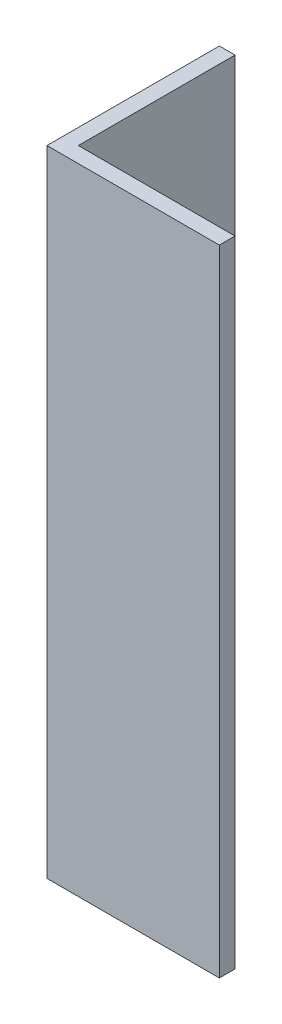
ISO-10303-21;
HEADER;
FILE_DESCRIPTION(('STEP AP214'),'2;1');
FILE_NAME('part.step','',(''),(''),'','','');
FILE_SCHEMA(('AUTOMOTIVE_DESIGN { 1 0 10303 214 1 1 1 1 }'));
ENDSEC;
DATA;
#1=APPLICATION_CONTEXT('core data for automotive mechanical design processes');
#2=APPLICATION_PROTOCOL_DEFINITION('international standard','automotive_design',2000,#1);
#3=PRODUCT_CONTEXT('',#1,'mechanical');
#4=PRODUCT('Part','Part','',(#3));
#5=PRODUCT_RELATED_PRODUCT_CATEGORY('part','',(#4));
#6=PRODUCT_DEFINITION_FORMATION('','',#4);
#7=PRODUCT_DEFINITION_CONTEXT('part definition',#1,'design');
#8=PRODUCT_DEFINITION('design','',#6,#7);
#9=PRODUCT_DEFINITION_SHAPE('','',#8);
#10=(LENGTH_UNIT() NAMED_UNIT(*) SI_UNIT(.MILLI.,.METRE.));
#11=(NAMED_UNIT(*) PLANE_ANGLE_UNIT() SI_UNIT($,.RADIAN.));
#12=(NAMED_UNIT(*) SI_UNIT($,.STERADIAN.) SOLID_ANGLE_UNIT());
#13=UNCERTAINTY_MEASURE_WITH_UNIT(LENGTH_MEASURE(1.E-05),#10,'distance_accuracy_value','');
#14=(GEOMETRIC_REPRESENTATION_CONTEXT(3) GLOBAL_UNCERTAINTY_ASSIGNED_CONTEXT((#13)) GLOBAL_UNIT_ASSIGNED_CONTEXT((#10,
#11,#12)) REPRESENTATION_CONTEXT('',''));
#15=CARTESIAN_POINT('',(0.,0.,0.));
#16=DIRECTION('',(0.,0.,1.));
#17=DIRECTION('',(1.,0.,0.));
#18=AXIS2_PLACEMENT_3D('',#15,#16,#17);
#19=CARTESIAN_POINT('',(-2.,81.,1.07187339486148));
#20=DIRECTION('',(0.,0.,1.));
#21=DIRECTION('',(1.,0.,0.));
#22=AXIS2_PLACEMENT_3D('',#19,#20,#21);
#23=PLANE('',#22);
#24=DIRECTION('',(-1.,0.,0.));
#25=VECTOR('',#24,1.);
#26=CARTESIAN_POINT('',(-2.,0.,1.07187339486148));
#27=LINE('',#26,#25);
#28=CARTESIAN_POINT('',(0.,0.,1.07187339486148));
#29=VERTEX_POINT('',#28);
#30=CARTESIAN_POINT('',(-2.,0.,1.07187339486148));
#31=VERTEX_POINT('',#30);
#32=EDGE_CURVE('E116',#29,#31,#27,.T.);
#33=ORIENTED_EDGE('',*,*,#32,.T.);
#34=DIRECTION('',(0.,-1.,0.));
#35=VECTOR('',#34,1.);
#36=CARTESIAN_POINT('',(-2.,81.,1.07187339486148));
#37=LINE('',#36,#35);
#38=CARTESIAN_POINT('',(-2.,81.,1.07187339486148));
#39=VERTEX_POINT('',#38);
#40=EDGE_CURVE('E11',#39,#31,#37,.T.);
#41=ORIENTED_EDGE('',*,*,#40,.F.);
#42=DIRECTION('',(-1.,0.,0.));
#43=VECTOR('',#42,1.);
#44=CARTESIAN_POINT('',(-2.,81.,1.07187339486148));
#45=LINE('',#44,#43);
#46=CARTESIAN_POINT('',(0.,81.,1.07187339486148));
#47=VERTEX_POINT('',#46);
#48=EDGE_CURVE('E126',#47,#39,#45,.T.);
#49=ORIENTED_EDGE('',*,*,#48,.F.);
#50=DIRECTION('',(0.,-1.,0.));
#51=VECTOR('',#50,1.);
#52=CARTESIAN_POINT('',(0.,81.,1.07187339486148));
#53=LINE('',#52,#51);
#54=EDGE_CURVE('E112',#47,#29,#53,.T.);
#55=ORIENTED_EDGE('',*,*,#54,.T.);
#56=EDGE_LOOP('',(#33,#41,#49,#55));
#57=FACE_BOUND('',#56,.T.);
#58=ADVANCED_FACE('F32',(#57),#23,.F.);
#59=CARTESIAN_POINT('',(-2.,81.,23.0718733948615));
#60=DIRECTION('',(1.,0.,0.));
#61=DIRECTION('',(0.,0.,-1.));
#62=AXIS2_PLACEMENT_3D('',#59,#60,#61);
#63=PLANE('',#62);
#64=DIRECTION('',(0.,0.,1.));
#65=VECTOR('',#64,1.);
#66=CARTESIAN_POINT('',(-2.,0.,23.0718733948615));
#67=LINE('',#66,#65);
#68=CARTESIAN_POINT('',(-2.,0.,23.0718733948615));
#69=VERTEX_POINT('',#68);
#70=EDGE_CURVE('E119',#31,#69,#67,.T.);
#71=ORIENTED_EDGE('',*,*,#70,.T.);
#72=DIRECTION('',(0.,-1.,0.));
#73=VECTOR('',#72,1.);
#74=CARTESIAN_POINT('',(-2.,81.,23.0718733948615));
#75=LINE('',#74,#73);
#76=CARTESIAN_POINT('',(-2.,81.,23.0718733948615));
#77=VERTEX_POINT('',#76);
#78=EDGE_CURVE('E40',#77,#69,#75,.T.);
#79=ORIENTED_EDGE('',*,*,#78,.F.);
#80=DIRECTION('',(0.,0.,1.));
#81=VECTOR('',#80,1.);
#82=CARTESIAN_POINT('',(-2.,81.,23.0718733948615));
#83=LINE('',#82,#81);
#84=EDGE_CURVE('E85',#39,#77,#83,.T.);
#85=ORIENTED_EDGE('',*,*,#84,.F.);
#86=ORIENTED_EDGE('',*,*,#40,.T.);
#87=EDGE_LOOP('',(#71,#79,#85,#86));
#88=FACE_BOUND('',#87,.T.);
#89=ADVANCED_FACE('F150',(#88),#63,.F.);
#90=CARTESIAN_POINT('',(20.,81.,23.0718733948615));
#91=DIRECTION('',(0.,0.,-1.));
#92=DIRECTION('',(-1.,0.,0.));
#93=AXIS2_PLACEMENT_3D('',#90,#91,#92);
#94=PLANE('',#93);
#95=DIRECTION('',(1.,0.,0.));
#96=VECTOR('',#95,1.);
#97=CARTESIAN_POINT('',(20.,0.,23.0718733948615));
#98=LINE('',#97,#96);
#99=CARTESIAN_POINT('',(20.,0.,23.0718733948615));
#100=VERTEX_POINT('',#99);
#101=EDGE_CURVE('E121',#69,#100,#98,.T.);
#102=ORIENTED_EDGE('',*,*,#101,.T.);
#103=DIRECTION('',(0.,-1.,0.));
#104=VECTOR('',#103,1.);
#105=CARTESIAN_POINT('',(20.,81.,23.0718733948615));
#106=LINE('',#105,#104);
#107=CARTESIAN_POINT('',(20.,81.,23.0718733948615));
#108=VERTEX_POINT('',#107);
#109=EDGE_CURVE('E107',#108,#100,#106,.T.);
#110=ORIENTED_EDGE('',*,*,#109,.F.);
#111=DIRECTION('',(1.,0.,0.));
#112=VECTOR('',#111,1.);
#113=CARTESIAN_POINT('',(20.,81.,23.0718733948615));
#114=LINE('',#113,#112);
#115=EDGE_CURVE('E98',#77,#108,#114,.T.);
#116=ORIENTED_EDGE('',*,*,#115,.F.);
#117=ORIENTED_EDGE('',*,*,#78,.T.);
#118=EDGE_LOOP('',(#102,#110,#116,#117));
#119=FACE_BOUND('',#118,.T.);
#120=ADVANCED_FACE('F132',(#119),#94,.F.);
#121=CARTESIAN_POINT('',(20.,81.,21.0718733948615));
#122=DIRECTION('',(-1.,0.,0.));
#123=DIRECTION('',(0.,0.,1.));
#124=AXIS2_PLACEMENT_3D('',#121,#122,#123);
#125=PLANE('',#124);
#126=DIRECTION('',(0.,0.,-1.));
#127=VECTOR('',#126,1.);
#128=CARTESIAN_POINT('',(20.,0.,21.0718733948615));
#129=LINE('',#128,#127);
#130=CARTESIAN_POINT('',(20.,0.,21.0718733948615));
#131=VERTEX_POINT('',#130);
#132=EDGE_CURVE('E106',#100,#131,#129,.T.);
#133=ORIENTED_EDGE('',*,*,#132,.T.);
#134=DIRECTION('',(0.,-1.,0.));
#135=VECTOR('',#134,1.);
#136=CARTESIAN_POINT('',(20.,81.,21.0718733948615));
#137=LINE('',#136,#135);
#138=CARTESIAN_POINT('',(20.,81.,21.0718733948615));
#139=VERTEX_POINT('',#138);
#140=EDGE_CURVE('E103',#139,#131,#137,.T.);
#141=ORIENTED_EDGE('',*,*,#140,.F.);
#142=DIRECTION('',(0.,0.,-1.));
#143=VECTOR('',#142,1.);
#144=CARTESIAN_POINT('',(20.,81.,21.0718733948615));
#145=LINE('',#144,#143);
#146=EDGE_CURVE('E92',#108,#139,#145,.T.);
#147=ORIENTED_EDGE('',*,*,#146,.F.);
#148=ORIENTED_EDGE('',*,*,#109,.T.);
#149=EDGE_LOOP('',(#133,#141,#147,#148));
#150=FACE_BOUND('',#149,.T.);
#151=ADVANCED_FACE('F104',(#150),#125,.F.);
#152=CARTESIAN_POINT('',(0.,81.,21.0718733948615));
#153=DIRECTION('',(0.,0.,1.));
#154=DIRECTION('',(1.,0.,0.));
#155=AXIS2_PLACEMENT_3D('',#152,#153,#154);
#156=PLANE('',#155);
#157=DIRECTION('',(-1.,0.,0.));
#158=VECTOR('',#157,1.);
#159=CARTESIAN_POINT('',(0.,0.,21.0718733948615));
#160=LINE('',#159,#158);
#161=CARTESIAN_POINT('',(0.,0.,21.0718733948615));
#162=VERTEX_POINT('',#161);
#163=EDGE_CURVE('E71',#131,#162,#160,.T.);
#164=ORIENTED_EDGE('',*,*,#163,.T.);
#165=DIRECTION('',(0.,-1.,0.));
#166=VECTOR('',#165,1.);
#167=CARTESIAN_POINT('',(0.,81.,21.0718733948615));
#168=LINE('',#167,#166);
#169=CARTESIAN_POINT('',(0.,81.,21.0718733948615));
#170=VERTEX_POINT('',#169);
#171=EDGE_CURVE('E108',#170,#162,#168,.T.);
#172=ORIENTED_EDGE('',*,*,#171,.F.);
#173=DIRECTION('',(-1.,0.,0.));
#174=VECTOR('',#173,1.);
#175=CARTESIAN_POINT('',(0.,81.,21.0718733948615));
#176=LINE('',#175,#174);
#177=EDGE_CURVE('E96',#139,#170,#176,.T.);
#178=ORIENTED_EDGE('',*,*,#177,.F.);
#179=ORIENTED_EDGE('',*,*,#140,.T.);
#180=EDGE_LOOP('',(#164,#172,#178,#179));
#181=FACE_BOUND('',#180,.T.);
#182=ADVANCED_FACE('F110',(#181),#156,.F.);
#183=CARTESIAN_POINT('',(0.,81.,1.07187339486148));
#184=DIRECTION('',(-1.,0.,0.));
#185=DIRECTION('',(0.,0.,1.));
#186=AXIS2_PLACEMENT_3D('',#183,#184,#185);
#187=PLANE('',#186);
#188=DIRECTION('',(0.,0.,-1.));
#189=VECTOR('',#188,1.);
#190=CARTESIAN_POINT('',(0.,0.,1.07187339486148));
#191=LINE('',#190,#189);
#192=EDGE_CURVE('E77',#162,#29,#191,.T.);
#193=ORIENTED_EDGE('',*,*,#192,.T.);
#194=ORIENTED_EDGE('',*,*,#54,.F.);
#195=DIRECTION('',(0.,0.,-1.));
#196=VECTOR('',#195,1.);
#197=CARTESIAN_POINT('',(0.,81.,1.07187339486148));
#198=LINE('',#197,#196);
#199=EDGE_CURVE('E48',#170,#47,#198,.T.);
#200=ORIENTED_EDGE('',*,*,#199,.F.);
#201=ORIENTED_EDGE('',*,*,#171,.T.);
#202=EDGE_LOOP('',(#193,#194,#200,#201));
#203=FACE_BOUND('',#202,.T.);
#204=ADVANCED_FACE('F139',(#203),#187,.F.);
#205=CARTESIAN_POINT('',(0.,81.,1.07187339486148));
#206=DIRECTION('',(0.,-1.,0.));
#207=DIRECTION('',(0.,0.,-1.));
#208=AXIS2_PLACEMENT_3D('',#205,#206,#207);
#209=PLANE('',#208);
#210=ORIENTED_EDGE('',*,*,#48,.T.);
#211=ORIENTED_EDGE('',*,*,#84,.T.);
#212=ORIENTED_EDGE('',*,*,#115,.T.);
#213=ORIENTED_EDGE('',*,*,#146,.T.);
#214=ORIENTED_EDGE('',*,*,#177,.T.);
#215=ORIENTED_EDGE('',*,*,#199,.T.);
#216=EDGE_LOOP('',(#210,#211,#212,#213,#214,#215));
#217=FACE_BOUND('',#216,.T.);
#218=ADVANCED_FACE('F94',(#217),#209,.F.);
#219=CARTESIAN_POINT('',(0.,0.,1.07187339486148));
#220=DIRECTION('',(0.,-1.,0.));
#221=DIRECTION('',(0.,0.,-1.));
#222=AXIS2_PLACEMENT_3D('',#219,#220,#221);
#223=PLANE('',#222);
#224=ORIENTED_EDGE('',*,*,#32,.F.);
#225=ORIENTED_EDGE('',*,*,#192,.F.);
#226=ORIENTED_EDGE('',*,*,#163,.F.);
#227=ORIENTED_EDGE('',*,*,#132,.F.);
#228=ORIENTED_EDGE('',*,*,#101,.F.);
#229=ORIENTED_EDGE('',*,*,#70,.F.);
#230=EDGE_LOOP('',(#224,#225,#226,#227,#228,#229));
#231=FACE_BOUND('',#230,.T.);
#232=ADVANCED_FACE('F135',(#231),#223,.T.);
#233=CLOSED_SHELL('',(#58,#89,#120,#151,#182,#204,#218,#232));
#234=MANIFOLD_SOLID_BREP('B2',#233);
#235=ADVANCED_BREP_SHAPE_REPRESENTATION('',(#18,#234),#14);
#236=SHAPE_DEFINITION_REPRESENTATION(#9,#235);
ENDSEC;
END-ISO-10303-21;
